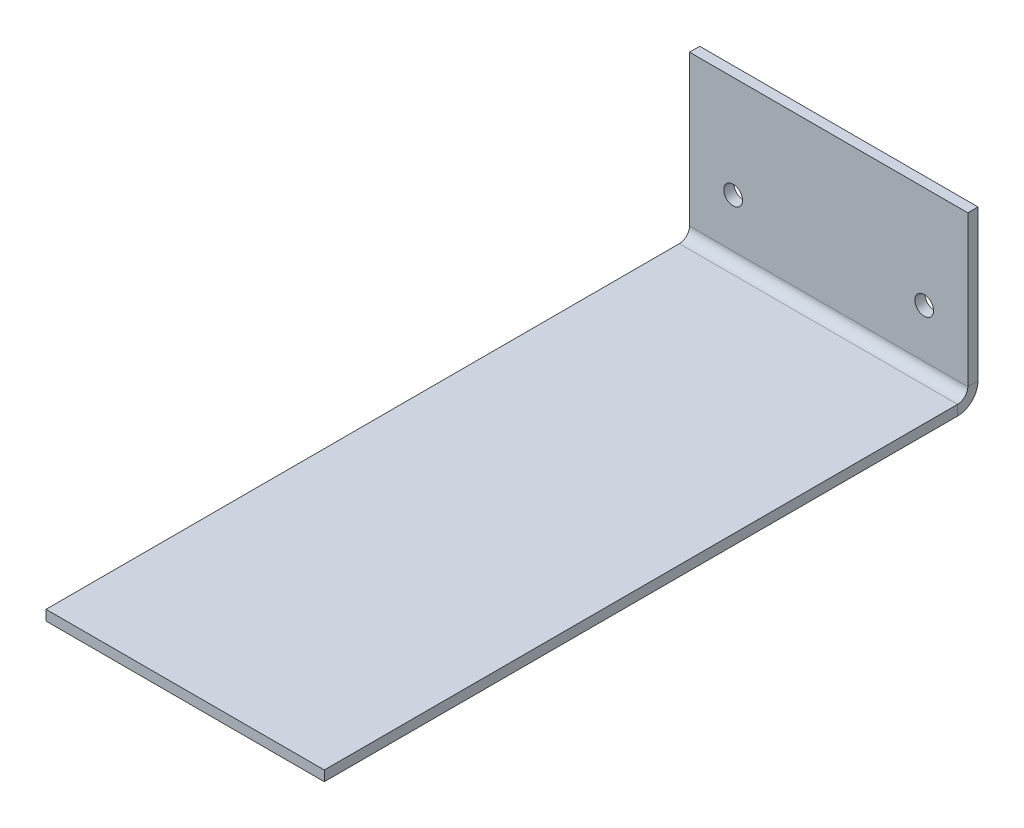
ISO-10303-21;
HEADER;
FILE_DESCRIPTION(('STEP AP214'),'2;1');
FILE_NAME('part.step','',(''),(''),'','','');
FILE_SCHEMA(('AUTOMOTIVE_DESIGN { 1 0 10303 214 1 1 1 1 }'));
ENDSEC;
DATA;
#1=APPLICATION_CONTEXT('core data for automotive mechanical design processes');
#2=APPLICATION_PROTOCOL_DEFINITION('international standard','automotive_design',2000,#1);
#3=PRODUCT_CONTEXT('',#1,'mechanical');
#4=PRODUCT('Part','Part','',(#3));
#5=PRODUCT_RELATED_PRODUCT_CATEGORY('part','',(#4));
#6=PRODUCT_DEFINITION_FORMATION('','',#4);
#7=PRODUCT_DEFINITION_CONTEXT('part definition',#1,'design');
#8=PRODUCT_DEFINITION('design','',#6,#7);
#9=PRODUCT_DEFINITION_SHAPE('','',#8);
#10=(LENGTH_UNIT() NAMED_UNIT(*) SI_UNIT(.MILLI.,.METRE.));
#11=(NAMED_UNIT(*) PLANE_ANGLE_UNIT() SI_UNIT($,.RADIAN.));
#12=(NAMED_UNIT(*) SI_UNIT($,.STERADIAN.) SOLID_ANGLE_UNIT());
#13=UNCERTAINTY_MEASURE_WITH_UNIT(LENGTH_MEASURE(1.E-05),#10,'distance_accuracy_value','');
#14=(GEOMETRIC_REPRESENTATION_CONTEXT(3) GLOBAL_UNCERTAINTY_ASSIGNED_CONTEXT((#13)) GLOBAL_UNIT_ASSIGNED_CONTEXT((#10,
#11,#12)) REPRESENTATION_CONTEXT('',''));
#15=CARTESIAN_POINT('',(0.,0.,0.));
#16=DIRECTION('',(0.,0.,1.));
#17=DIRECTION('',(1.,0.,0.));
#18=AXIS2_PLACEMENT_3D('',#15,#16,#17);
#19=CARTESIAN_POINT('',(0.,-26.840888202504,-25.559311797496));
#20=DIRECTION('',(-1.,0.,0.));
#21=DIRECTION('',(0.,0.,1.));
#22=AXIS2_PLACEMENT_3D('',#19,#20,#21);
#23=PLANE('',#22);
#24=DIRECTION('',(0.,0.,1.));
#25=VECTOR('',#24,1.);
#26=CARTESIAN_POINT('',(0.,-25.240688202504,-25.559311797496));
#27=LINE('',#26,#25);
#28=CARTESIAN_POINT('',(0.,-25.240688202504,1.6002));
#29=VERTEX_POINT('',#28);
#30=CARTESIAN_POINT('',(0.,-25.2406882025036,101.040688202504));
#31=VERTEX_POINT('',#30);
#32=EDGE_CURVE('E74',#29,#31,#27,.T.);
#33=ORIENTED_EDGE('',*,*,#32,.F.);
#34=DIRECTION('',(0.,-1.,0.));
#35=VECTOR('',#34,1.);
#36=CARTESIAN_POINT('',(0.,-26.8408882025041,1.60020000000001));
#37=LINE('',#36,#35);
#38=CARTESIAN_POINT('',(0.,-26.8408882025039,1.60020000000001));
#39=VERTEX_POINT('',#38);
#40=EDGE_CURVE('E115',#29,#39,#37,.T.);
#41=ORIENTED_EDGE('',*,*,#40,.T.);
#42=DIRECTION('',(0.,0.,1.));
#43=VECTOR('',#42,1.);
#44=CARTESIAN_POINT('',(0.,-26.840888202504,-25.559311797496));
#45=LINE('',#44,#43);
#46=CARTESIAN_POINT('',(0.,-26.8408882025036,101.040688202504));
#47=VERTEX_POINT('',#46);
#48=EDGE_CURVE('E53',#39,#47,#45,.T.);
#49=ORIENTED_EDGE('',*,*,#48,.T.);
#50=DIRECTION('',(0.,1.,0.));
#51=VECTOR('',#50,1.);
#52=CARTESIAN_POINT('',(0.,-26.8408882025036,101.040688202504));
#53=LINE('',#52,#51);
#54=EDGE_CURVE('E226',#47,#31,#53,.T.);
#55=ORIENTED_EDGE('',*,*,#54,.T.);
#56=EDGE_LOOP('',(#33,#41,#49,#55));
#57=FACE_BOUND('',#56,.T.);
#58=ADVANCED_FACE('F49',(#57),#23,.T.);
#59=CARTESIAN_POINT('',(43.69375,-26.8408882025041,-25.559311797496));
#60=DIRECTION('',(1.,0.,0.));
#61=DIRECTION('',(0.,0.,-1.));
#62=AXIS2_PLACEMENT_3D('',#59,#60,#61);
#63=PLANE('',#62);
#64=DIRECTION('',(0.,0.,-1.));
#65=VECTOR('',#64,1.);
#66=CARTESIAN_POINT('',(43.69375,-26.8408882025041,-25.559311797496));
#67=LINE('',#66,#65);
#68=CARTESIAN_POINT('',(43.69375,-26.8408882025036,101.040688202504));
#69=VERTEX_POINT('',#68);
#70=CARTESIAN_POINT('',(43.69375,-26.840888202504,1.6002));
#71=VERTEX_POINT('',#70);
#72=EDGE_CURVE('E220',#69,#71,#67,.T.);
#73=ORIENTED_EDGE('',*,*,#72,.T.);
#74=DIRECTION('',(0.,1.,0.));
#75=VECTOR('',#74,1.);
#76=CARTESIAN_POINT('',(43.69375,-26.8408882025041,1.60020000000001));
#77=LINE('',#76,#75);
#78=CARTESIAN_POINT('',(43.69375,-25.240688202504,1.6002));
#79=VERTEX_POINT('',#78);
#80=EDGE_CURVE('E12',#71,#79,#77,.T.);
#81=ORIENTED_EDGE('',*,*,#80,.T.);
#82=DIRECTION('',(0.,0.,-1.));
#83=VECTOR('',#82,1.);
#84=CARTESIAN_POINT('',(43.69375,-25.2406882025041,-25.559311797496));
#85=LINE('',#84,#83);
#86=CARTESIAN_POINT('',(43.69375,-25.2406882025036,101.040688202504));
#87=VERTEX_POINT('',#86);
#88=EDGE_CURVE('E67',#87,#79,#85,.T.);
#89=ORIENTED_EDGE('',*,*,#88,.F.);
#90=DIRECTION('',(0.,1.,0.));
#91=VECTOR('',#90,1.);
#92=CARTESIAN_POINT('',(43.69375,-26.8408882025036,101.040688202504));
#93=LINE('',#92,#91);
#94=EDGE_CURVE('E143',#69,#87,#93,.T.);
#95=ORIENTED_EDGE('',*,*,#94,.F.);
#96=EDGE_LOOP('',(#73,#81,#89,#95));
#97=FACE_BOUND('',#96,.T.);
#98=ADVANCED_FACE('F51',(#97),#63,.T.);
#99=CARTESIAN_POINT('',(0.,-25.240688202504,-25.559311797496));
#100=DIRECTION('',(0.,1.,0.));
#101=DIRECTION('',(1.,0.,0.));
#102=AXIS2_PLACEMENT_3D('',#99,#100,#101);
#103=PLANE('',#102);
#104=ORIENTED_EDGE('',*,*,#88,.T.);
#105=DIRECTION('',(-1.,0.,0.));
#106=VECTOR('',#105,1.);
#107=CARTESIAN_POINT('',(0.,-25.240688202504,1.60020000000001));
#108=LINE('',#107,#106);
#109=EDGE_CURVE('E59',#79,#29,#108,.T.);
#110=ORIENTED_EDGE('',*,*,#109,.T.);
#111=ORIENTED_EDGE('',*,*,#32,.T.);
#112=DIRECTION('',(1.,0.,0.));
#113=VECTOR('',#112,1.);
#114=CARTESIAN_POINT('',(0.,-25.2406882025036,101.040688202504));
#115=LINE('',#114,#113);
#116=EDGE_CURVE('E221',#31,#87,#115,.T.);
#117=ORIENTED_EDGE('',*,*,#116,.T.);
#118=EDGE_LOOP('',(#104,#110,#111,#117));
#119=FACE_BOUND('',#118,.T.);
#120=ADVANCED_FACE('F235',(#119),#103,.T.);
#121=CARTESIAN_POINT('',(0.,-26.8408882025036,101.040688202504));
#122=DIRECTION('',(0.,0.,1.));
#123=DIRECTION('',(0.,-1.,0.));
#124=AXIS2_PLACEMENT_3D('',#121,#122,#123);
#125=PLANE('',#124);
#126=ORIENTED_EDGE('',*,*,#116,.F.);
#127=ORIENTED_EDGE('',*,*,#54,.F.);
#128=DIRECTION('',(1.,0.,0.));
#129=VECTOR('',#128,1.);
#130=CARTESIAN_POINT('',(0.,-26.8408882025036,101.040688202504));
#131=LINE('',#130,#129);
#132=EDGE_CURVE('E132',#47,#69,#131,.T.);
#133=ORIENTED_EDGE('',*,*,#132,.T.);
#134=ORIENTED_EDGE('',*,*,#94,.T.);
#135=EDGE_LOOP('',(#126,#127,#133,#134));
#136=FACE_BOUND('',#135,.T.);
#137=ADVANCED_FACE('F239',(#136),#125,.T.);
#138=CARTESIAN_POINT('',(0.,-26.840888202504,-25.559311797496));
#139=DIRECTION('',(0.,1.,0.));
#140=DIRECTION('',(1.,0.,0.));
#141=AXIS2_PLACEMENT_3D('',#138,#139,#140);
#142=PLANE('',#141);
#143=DIRECTION('',(-1.,0.,0.));
#144=VECTOR('',#143,1.);
#145=CARTESIAN_POINT('',(0.,-26.840888202504,1.60020000000001));
#146=LINE('',#145,#144);
#147=EDGE_CURVE('E123',#71,#39,#146,.T.);
#148=ORIENTED_EDGE('',*,*,#147,.F.);
#149=ORIENTED_EDGE('',*,*,#72,.F.);
#150=ORIENTED_EDGE('',*,*,#132,.F.);
#151=ORIENTED_EDGE('',*,*,#48,.F.);
#152=EDGE_LOOP('',(#148,#149,#150,#151));
#153=FACE_BOUND('',#152,.T.);
#154=ADVANCED_FACE('F128',(#153),#142,.F.);
#155=CARTESIAN_POINT('',(0.,0.,-1.6002));
#156=DIRECTION('',(0.,1.,0.));
#157=DIRECTION('',(0.,0.,1.));
#158=AXIS2_PLACEMENT_3D('',#155,#156,#157);
#159=PLANE('',#158);
#160=DIRECTION('',(-1.,0.,0.));
#161=VECTOR('',#160,1.);
#162=CARTESIAN_POINT('',(0.,0.,0.));
#163=LINE('',#162,#161);
#164=CARTESIAN_POINT('',(43.69375,0.,0.));
#165=VERTEX_POINT('',#164);
#166=CARTESIAN_POINT('',(0.,0.,0.));
#167=VERTEX_POINT('',#166);
#168=EDGE_CURVE('E176',#165,#167,#163,.T.);
#169=ORIENTED_EDGE('',*,*,#168,.F.);
#170=DIRECTION('',(0.,0.,1.));
#171=VECTOR('',#170,1.);
#172=CARTESIAN_POINT('',(43.69375,0.,-1.6002));
#173=LINE('',#172,#171);
#174=CARTESIAN_POINT('',(43.69375,0.,-1.6002));
#175=VERTEX_POINT('',#174);
#176=EDGE_CURVE('E166',#175,#165,#173,.T.);
#177=ORIENTED_EDGE('',*,*,#176,.F.);
#178=DIRECTION('',(-1.,0.,0.));
#179=VECTOR('',#178,1.);
#180=CARTESIAN_POINT('',(0.,0.,-1.6002));
#181=LINE('',#180,#179);
#182=CARTESIAN_POINT('',(0.,0.,-1.6002));
#183=VERTEX_POINT('',#182);
#184=EDGE_CURVE('E209',#175,#183,#181,.T.);
#185=ORIENTED_EDGE('',*,*,#184,.T.);
#186=DIRECTION('',(0.,0.,1.));
#187=VECTOR('',#186,1.);
#188=CARTESIAN_POINT('',(0.,0.,-1.6002));
#189=LINE('',#188,#187);
#190=EDGE_CURVE('E206',#183,#167,#189,.T.);
#191=ORIENTED_EDGE('',*,*,#190,.T.);
#192=EDGE_LOOP('',(#169,#177,#185,#191));
#193=FACE_BOUND('',#192,.T.);
#194=ADVANCED_FACE('F264',(#193),#159,.T.);
#195=CARTESIAN_POINT('',(6.846875,-16.01,-1.6002));
#196=DIRECTION('',(0.,0.,1.));
#197=DIRECTION('',(1.,0.,0.));
#198=AXIS2_PLACEMENT_3D('',#195,#196,#197);
#199=CYLINDRICAL_SURFACE('',#198,1.4732);
#200=CARTESIAN_POINT('',(6.846875,-16.01,-1.6002));
#201=DIRECTION('',(0.,0.,1.));
#202=DIRECTION('',(1.,0.,0.));
#203=AXIS2_PLACEMENT_3D('',#200,#201,#202);
#204=CIRCLE('',#203,1.4732);
#205=CARTESIAN_POINT('',(8.320075,-16.01,-1.6002));
#206=VERTEX_POINT('',#205);
#207=EDGE_CURVE('E190',#206,#206,#204,.T.);
#208=ORIENTED_EDGE('',*,*,#207,.F.);
#209=EDGE_LOOP('',(#208));
#210=FACE_BOUND('',#209,.T.);
#211=CARTESIAN_POINT('',(6.846875,-16.01,0.));
#212=DIRECTION('',(0.,0.,1.));
#213=DIRECTION('',(1.,0.,0.));
#214=AXIS2_PLACEMENT_3D('',#211,#212,#213);
#215=CIRCLE('',#214,1.4732);
#216=CARTESIAN_POINT('',(8.320075,-16.01,0.));
#217=VERTEX_POINT('',#216);
#218=EDGE_CURVE('E202',#217,#217,#215,.T.);
#219=ORIENTED_EDGE('',*,*,#218,.T.);
#220=EDGE_LOOP('',(#219));
#221=FACE_BOUND('',#220,.T.);
#222=ADVANCED_FACE('F266',(#210,#221),#199,.F.);
#223=CARTESIAN_POINT('',(36.846875,-16.01,-1.6002));
#224=DIRECTION('',(0.,0.,1.));
#225=DIRECTION('',(1.,0.,0.));
#226=AXIS2_PLACEMENT_3D('',#223,#224,#225);
#227=CYLINDRICAL_SURFACE('',#226,1.4732);
#228=CARTESIAN_POINT('',(36.846875,-16.01,-1.6002));
#229=DIRECTION('',(0.,0.,1.));
#230=DIRECTION('',(1.,0.,0.));
#231=AXIS2_PLACEMENT_3D('',#228,#229,#230);
#232=CIRCLE('',#231,1.4732);
#233=CARTESIAN_POINT('',(38.320075,-16.01,-1.6002));
#234=VERTEX_POINT('',#233);
#235=EDGE_CURVE('E194',#234,#234,#232,.T.);
#236=ORIENTED_EDGE('',*,*,#235,.F.);
#237=EDGE_LOOP('',(#236));
#238=FACE_BOUND('',#237,.T.);
#239=CARTESIAN_POINT('',(36.846875,-16.01,0.));
#240=DIRECTION('',(0.,0.,1.));
#241=DIRECTION('',(1.,0.,0.));
#242=AXIS2_PLACEMENT_3D('',#239,#240,#241);
#243=CIRCLE('',#242,1.4732);
#244=CARTESIAN_POINT('',(38.320075,-16.01,0.));
#245=VERTEX_POINT('',#244);
#246=EDGE_CURVE('E198',#245,#245,#243,.T.);
#247=ORIENTED_EDGE('',*,*,#246,.T.);
#248=EDGE_LOOP('',(#247));
#249=FACE_BOUND('',#248,.T.);
#250=ADVANCED_FACE('F272',(#238,#249),#227,.F.);
#251=CARTESIAN_POINT('',(0.,0.,-1.6002));
#252=DIRECTION('',(0.,0.,1.));
#253=DIRECTION('',(1.,0.,0.));
#254=AXIS2_PLACEMENT_3D('',#251,#252,#253);
#255=PLANE('',#254);
#256=ORIENTED_EDGE('',*,*,#235,.T.);
#257=EDGE_LOOP('',(#256));
#258=FACE_BOUND('',#257,.T.);
#259=ORIENTED_EDGE('',*,*,#207,.T.);
#260=EDGE_LOOP('',(#259));
#261=FACE_BOUND('',#260,.T.);
#262=DIRECTION('',(0.,1.,0.));
#263=VECTOR('',#262,1.);
#264=CARTESIAN_POINT('',(43.69375,0.,-1.6002));
#265=LINE('',#264,#263);
#266=CARTESIAN_POINT('',(43.69375,-23.640488202504,-1.6002));
#267=VERTEX_POINT('',#266);
#268=EDGE_CURVE('E170',#267,#175,#265,.T.);
#269=ORIENTED_EDGE('',*,*,#268,.F.);
#270=DIRECTION('',(-1.,0.,0.));
#271=VECTOR('',#270,1.);
#272=CARTESIAN_POINT('',(0.,-23.6404882025039,-1.6002));
#273=LINE('',#272,#271);
#274=CARTESIAN_POINT('',(0.,-23.640488202504,-1.6002));
#275=VERTEX_POINT('',#274);
#276=EDGE_CURVE('E186',#267,#275,#273,.T.);
#277=ORIENTED_EDGE('',*,*,#276,.T.);
#278=DIRECTION('',(0.,-1.,0.));
#279=VECTOR('',#278,1.);
#280=CARTESIAN_POINT('',(0.,0.,-1.6002));
#281=LINE('',#280,#279);
#282=EDGE_CURVE('E183',#183,#275,#281,.T.);
#283=ORIENTED_EDGE('',*,*,#282,.F.);
#284=ORIENTED_EDGE('',*,*,#184,.F.);
#285=EDGE_LOOP('',(#269,#277,#283,#284));
#286=FACE_BOUND('',#285,.T.);
#287=ADVANCED_FACE('F262',(#258,#261,#286),#255,.F.);
#288=CARTESIAN_POINT('',(0.,0.,-1.6002));
#289=DIRECTION('',(-1.,0.,0.));
#290=DIRECTION('',(0.,-1.,0.));
#291=AXIS2_PLACEMENT_3D('',#288,#289,#290);
#292=PLANE('',#291);
#293=DIRECTION('',(0.,0.,-1.));
#294=VECTOR('',#293,1.);
#295=CARTESIAN_POINT('',(0.,-23.6404882025039,-1.60020000000017));
#296=LINE('',#295,#294);
#297=CARTESIAN_POINT('',(0.,-23.640488202504,0.));
#298=VERTEX_POINT('',#297);
#299=EDGE_CURVE('E148',#298,#275,#296,.T.);
#300=ORIENTED_EDGE('',*,*,#299,.F.);
#301=DIRECTION('',(0.,-1.,0.));
#302=VECTOR('',#301,1.);
#303=CARTESIAN_POINT('',(0.,0.,0.));
#304=LINE('',#303,#302);
#305=EDGE_CURVE('E173',#167,#298,#304,.T.);
#306=ORIENTED_EDGE('',*,*,#305,.F.);
#307=ORIENTED_EDGE('',*,*,#190,.F.);
#308=ORIENTED_EDGE('',*,*,#282,.T.);
#309=EDGE_LOOP('',(#300,#306,#307,#308));
#310=FACE_BOUND('',#309,.T.);
#311=ADVANCED_FACE('F258',(#310),#292,.T.);
#312=CARTESIAN_POINT('',(0.,0.,0.));
#313=DIRECTION('',(0.,0.,1.));
#314=DIRECTION('',(1.,0.,0.));
#315=AXIS2_PLACEMENT_3D('',#312,#313,#314);
#316=PLANE('',#315);
#317=DIRECTION('',(-1.,0.,0.));
#318=VECTOR('',#317,1.);
#319=CARTESIAN_POINT('',(0.,-23.640488202504,0.));
#320=LINE('',#319,#318);
#321=CARTESIAN_POINT('',(43.69375,-23.640488202504,0.));
#322=VERTEX_POINT('',#321);
#323=EDGE_CURVE('E155',#322,#298,#320,.T.);
#324=ORIENTED_EDGE('',*,*,#323,.F.);
#325=DIRECTION('',(0.,1.,0.));
#326=VECTOR('',#325,1.);
#327=CARTESIAN_POINT('',(43.69375,0.,0.));
#328=LINE('',#327,#326);
#329=EDGE_CURVE('E180',#322,#165,#328,.T.);
#330=ORIENTED_EDGE('',*,*,#329,.T.);
#331=ORIENTED_EDGE('',*,*,#168,.T.);
#332=ORIENTED_EDGE('',*,*,#305,.T.);
#333=EDGE_LOOP('',(#324,#330,#331,#332));
#334=FACE_BOUND('',#333,.T.);
#335=ORIENTED_EDGE('',*,*,#246,.F.);
#336=EDGE_LOOP('',(#335));
#337=FACE_BOUND('',#336,.T.);
#338=ORIENTED_EDGE('',*,*,#218,.F.);
#339=EDGE_LOOP('',(#338));
#340=FACE_BOUND('',#339,.T.);
#341=ADVANCED_FACE('F254',(#334,#337,#340),#316,.T.);
#342=CARTESIAN_POINT('',(43.69375,0.,-1.6002));
#343=DIRECTION('',(1.,0.,0.));
#344=DIRECTION('',(0.,1.,0.));
#345=AXIS2_PLACEMENT_3D('',#342,#343,#344);
#346=PLANE('',#345);
#347=DIRECTION('',(0.,0.,1.));
#348=VECTOR('',#347,1.);
#349=CARTESIAN_POINT('',(43.69375,-23.640488202504,-1.60020000000017));
#350=LINE('',#349,#348);
#351=EDGE_CURVE('E150',#267,#322,#350,.T.);
#352=ORIENTED_EDGE('',*,*,#351,.F.);
#353=ORIENTED_EDGE('',*,*,#268,.T.);
#354=ORIENTED_EDGE('',*,*,#176,.T.);
#355=ORIENTED_EDGE('',*,*,#329,.F.);
#356=EDGE_LOOP('',(#352,#353,#354,#355));
#357=FACE_BOUND('',#356,.T.);
#358=ADVANCED_FACE('F249',(#357),#346,.T.);
#359=CARTESIAN_POINT('',(43.69375,-23.640488202504,1.6002));
#360=DIRECTION('',(1.,0.,0.));
#361=DIRECTION('',(0.,0.,-1.));
#362=AXIS2_PLACEMENT_3D('',#359,#360,#361);
#363=PLANE('',#362);
#364=ORIENTED_EDGE('',*,*,#351,.T.);
#365=CARTESIAN_POINT('',(43.69375,-23.640488202504,1.6002));
#366=DIRECTION('',(-1.,0.,0.));
#367=DIRECTION('',(0.,-1.,0.));
#368=AXIS2_PLACEMENT_3D('',#365,#366,#367);
#369=CIRCLE('',#368,1.6002);
#370=EDGE_CURVE('E162',#322,#79,#369,.T.);
#371=ORIENTED_EDGE('',*,*,#370,.T.);
#372=ORIENTED_EDGE('',*,*,#80,.F.);
#373=CARTESIAN_POINT('',(43.69375,-23.640488202504,1.6002));
#374=DIRECTION('',(-1.,0.,0.));
#375=DIRECTION('',(0.,0.,-1.));
#376=AXIS2_PLACEMENT_3D('',#373,#374,#375);
#377=CIRCLE('',#376,3.2004);
#378=EDGE_CURVE('E141',#267,#71,#377,.T.);
#379=ORIENTED_EDGE('',*,*,#378,.F.);
#380=EDGE_LOOP('',(#364,#371,#372,#379));
#381=FACE_BOUND('',#380,.T.);
#382=ADVANCED_FACE('F246',(#381),#363,.T.);
#383=CARTESIAN_POINT('',(0.,-23.6404882025039,1.6002));
#384=DIRECTION('',(-1.,0.,0.));
#385=DIRECTION('',(0.,-1.,0.));
#386=AXIS2_PLACEMENT_3D('',#383,#384,#385);
#387=PLANE('',#386);
#388=ORIENTED_EDGE('',*,*,#40,.F.);
#389=CARTESIAN_POINT('',(0.,-23.6404882025039,1.6002));
#390=DIRECTION('',(-1.,0.,0.));
#391=DIRECTION('',(0.,-1.,0.));
#392=AXIS2_PLACEMENT_3D('',#389,#390,#391);
#393=CIRCLE('',#392,1.6002);
#394=EDGE_CURVE('E157',#29,#298,#393,.F.);
#395=ORIENTED_EDGE('',*,*,#394,.T.);
#396=ORIENTED_EDGE('',*,*,#299,.T.);
#397=CARTESIAN_POINT('',(0.,-23.6404882025039,1.6002));
#398=DIRECTION('',(1.,0.,0.));
#399=DIRECTION('',(0.,-1.,0.));
#400=AXIS2_PLACEMENT_3D('',#397,#398,#399);
#401=CIRCLE('',#400,3.2004);
#402=EDGE_CURVE('E139',#39,#275,#401,.T.);
#403=ORIENTED_EDGE('',*,*,#402,.F.);
#404=EDGE_LOOP('',(#388,#395,#396,#403));
#405=FACE_BOUND('',#404,.T.);
#406=ADVANCED_FACE('F146',(#405),#387,.T.);
#407=CARTESIAN_POINT('',(65.7113020014395,-23.640488202504,1.6002));
#408=DIRECTION('',(-1.,0.,0.));
#409=DIRECTION('',(0.,-1.,0.));
#410=AXIS2_PLACEMENT_3D('',#407,#408,#409);
#411=CYLINDRICAL_SURFACE('',#410,3.2004);
#412=ORIENTED_EDGE('',*,*,#402,.T.);
#413=ORIENTED_EDGE('',*,*,#276,.F.);
#414=ORIENTED_EDGE('',*,*,#378,.T.);
#415=ORIENTED_EDGE('',*,*,#147,.T.);
#416=EDGE_LOOP('',(#412,#413,#414,#415));
#417=FACE_BOUND('',#416,.T.);
#418=ADVANCED_FACE('F137',(#417),#411,.T.);
#419=CARTESIAN_POINT('',(65.7113020014395,-23.640488202504,1.6002));
#420=DIRECTION('',(-1.,0.,0.));
#421=DIRECTION('',(0.,-1.,0.));
#422=AXIS2_PLACEMENT_3D('',#419,#420,#421);
#423=CYLINDRICAL_SURFACE('',#422,1.6002);
#424=ORIENTED_EDGE('',*,*,#394,.F.);
#425=ORIENTED_EDGE('',*,*,#109,.F.);
#426=ORIENTED_EDGE('',*,*,#370,.F.);
#427=ORIENTED_EDGE('',*,*,#323,.T.);
#428=EDGE_LOOP('',(#424,#425,#426,#427));
#429=FACE_BOUND('',#428,.T.);
#430=ADVANCED_FACE('F245',(#429),#423,.F.);
#431=CLOSED_SHELL('',(#58,#98,#120,#137,#154,#194,#222,#250,#287,#311,#341,#358,#382,#406,#418,#430));
#432=MANIFOLD_SOLID_BREP('B2',#431);
#433=ADVANCED_BREP_SHAPE_REPRESENTATION('',(#18,#432),#14);
#434=SHAPE_DEFINITION_REPRESENTATION(#9,#433);
ENDSEC;
END-ISO-10303-21;
